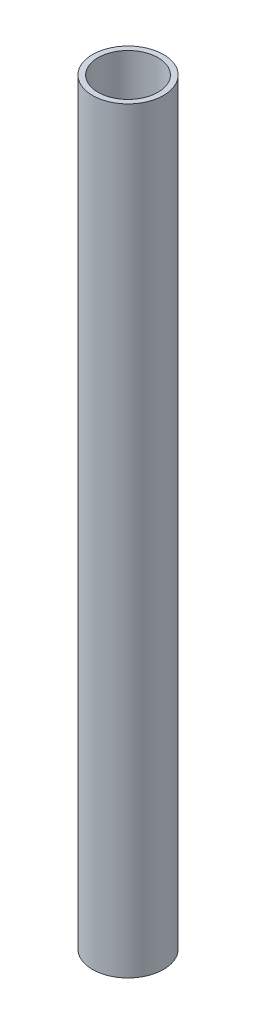
ISO-10303-21;
HEADER;
FILE_DESCRIPTION(('STEP AP214'),'2;1');
FILE_NAME('part.step','',(''),(''),'','','');
FILE_SCHEMA(('AUTOMOTIVE_DESIGN { 1 0 10303 214 1 1 1 1 }'));
ENDSEC;
DATA;
#1=APPLICATION_CONTEXT('core data for automotive mechanical design processes');
#2=APPLICATION_PROTOCOL_DEFINITION('international standard','automotive_design',2000,#1);
#3=PRODUCT_CONTEXT('',#1,'mechanical');
#4=PRODUCT('Part','Part','',(#3));
#5=PRODUCT_RELATED_PRODUCT_CATEGORY('part','',(#4));
#6=PRODUCT_DEFINITION_FORMATION('','',#4);
#7=PRODUCT_DEFINITION_CONTEXT('part definition',#1,'design');
#8=PRODUCT_DEFINITION('design','',#6,#7);
#9=PRODUCT_DEFINITION_SHAPE('','',#8);
#10=(LENGTH_UNIT() NAMED_UNIT(*) SI_UNIT(.MILLI.,.METRE.));
#11=(NAMED_UNIT(*) PLANE_ANGLE_UNIT() SI_UNIT($,.RADIAN.));
#12=(NAMED_UNIT(*) SI_UNIT($,.STERADIAN.) SOLID_ANGLE_UNIT());
#13=UNCERTAINTY_MEASURE_WITH_UNIT(LENGTH_MEASURE(1.E-05),#10,'distance_accuracy_value','');
#14=(GEOMETRIC_REPRESENTATION_CONTEXT(3) GLOBAL_UNCERTAINTY_ASSIGNED_CONTEXT((#13)) GLOBAL_UNIT_ASSIGNED_CONTEXT((#10,
#11,#12)) REPRESENTATION_CONTEXT('',''));
#15=CARTESIAN_POINT('',(0.,0.,0.));
#16=DIRECTION('',(0.,0.,1.));
#17=DIRECTION('',(1.,0.,0.));
#18=AXIS2_PLACEMENT_3D('',#15,#16,#17);
#19=CARTESIAN_POINT('',(0.,152.4,0.));
#20=DIRECTION('',(0.,-1.,0.));
#21=DIRECTION('',(0.,0.,-1.));
#22=AXIS2_PLACEMENT_3D('',#19,#20,#21);
#23=CYLINDRICAL_SURFACE('',#22,8.0518);
#24=CARTESIAN_POINT('',(0.,152.4,0.));
#25=DIRECTION('',(0.,-1.,0.));
#26=DIRECTION('',(1.,0.,0.));
#27=AXIS2_PLACEMENT_3D('',#24,#25,#26);
#28=CIRCLE('',#27,8.0518);
#29=CARTESIAN_POINT('',(8.0518,152.4,0.));
#30=VERTEX_POINT('',#29);
#31=EDGE_CURVE('E9',#30,#30,#28,.T.);
#32=ORIENTED_EDGE('',*,*,#31,.F.);
#33=EDGE_LOOP('',(#32));
#34=FACE_BOUND('',#33,.T.);
#35=CARTESIAN_POINT('',(0.,-50.8,0.));
#36=DIRECTION('',(0.,-1.,0.));
#37=DIRECTION('',(1.,0.,0.));
#38=AXIS2_PLACEMENT_3D('',#35,#36,#37);
#39=CIRCLE('',#38,8.0518);
#40=CARTESIAN_POINT('',(8.0518,-50.8,0.));
#41=VERTEX_POINT('',#40);
#42=EDGE_CURVE('E27',#41,#41,#39,.T.);
#43=ORIENTED_EDGE('',*,*,#42,.T.);
#44=EDGE_LOOP('',(#43));
#45=FACE_BOUND('',#44,.T.);
#46=ADVANCED_FACE('F14',(#34,#45),#23,.F.);
#47=CARTESIAN_POINT('',(0.,152.4,0.));
#48=DIRECTION('',(0.,-1.,0.));
#49=DIRECTION('',(0.,0.,-1.));
#50=AXIS2_PLACEMENT_3D('',#47,#48,#49);
#51=CYLINDRICAL_SURFACE('',#50,9.525);
#52=CARTESIAN_POINT('',(0.,152.4,0.));
#53=DIRECTION('',(0.,-1.,0.));
#54=DIRECTION('',(1.,0.,0.));
#55=AXIS2_PLACEMENT_3D('',#52,#53,#54);
#56=CIRCLE('',#55,9.525);
#57=CARTESIAN_POINT('',(9.525,152.4,0.));
#58=VERTEX_POINT('',#57);
#59=EDGE_CURVE('E22',#58,#58,#56,.T.);
#60=ORIENTED_EDGE('',*,*,#59,.T.);
#61=EDGE_LOOP('',(#60));
#62=FACE_BOUND('',#61,.T.);
#63=CARTESIAN_POINT('',(0.,-50.8,0.));
#64=DIRECTION('',(0.,-1.,0.));
#65=DIRECTION('',(1.,0.,0.));
#66=AXIS2_PLACEMENT_3D('',#63,#64,#65);
#67=CIRCLE('',#66,9.525);
#68=CARTESIAN_POINT('',(9.525,-50.8,0.));
#69=VERTEX_POINT('',#68);
#70=EDGE_CURVE('E18',#69,#69,#67,.T.);
#71=ORIENTED_EDGE('',*,*,#70,.F.);
#72=EDGE_LOOP('',(#71));
#73=FACE_BOUND('',#72,.T.);
#74=ADVANCED_FACE('F41',(#62,#73),#51,.T.);
#75=CARTESIAN_POINT('',(0.,152.4,0.));
#76=DIRECTION('',(0.,-1.,0.));
#77=DIRECTION('',(0.,0.,-1.));
#78=AXIS2_PLACEMENT_3D('',#75,#76,#77);
#79=PLANE('',#78);
#80=ORIENTED_EDGE('',*,*,#31,.T.);
#81=EDGE_LOOP('',(#80));
#82=FACE_BOUND('',#81,.T.);
#83=ORIENTED_EDGE('',*,*,#59,.F.);
#84=EDGE_LOOP('',(#83));
#85=FACE_BOUND('',#84,.T.);
#86=ADVANCED_FACE('F43',(#82,#85),#79,.F.);
#87=CARTESIAN_POINT('',(0.,-50.8,0.));
#88=DIRECTION('',(0.,-1.,0.));
#89=DIRECTION('',(0.,0.,-1.));
#90=AXIS2_PLACEMENT_3D('',#87,#88,#89);
#91=PLANE('',#90);
#92=ORIENTED_EDGE('',*,*,#42,.F.);
#93=EDGE_LOOP('',(#92));
#94=FACE_BOUND('',#93,.T.);
#95=ORIENTED_EDGE('',*,*,#70,.T.);
#96=EDGE_LOOP('',(#95));
#97=FACE_BOUND('',#96,.T.);
#98=ADVANCED_FACE('F16',(#94,#97),#91,.T.);
#99=CLOSED_SHELL('',(#46,#74,#86,#98));
#100=MANIFOLD_SOLID_BREP('B1',#99);
#101=ADVANCED_BREP_SHAPE_REPRESENTATION('',(#18,#100),#14);
#102=SHAPE_DEFINITION_REPRESENTATION(#9,#101);
ENDSEC;
END-ISO-10303-21;
